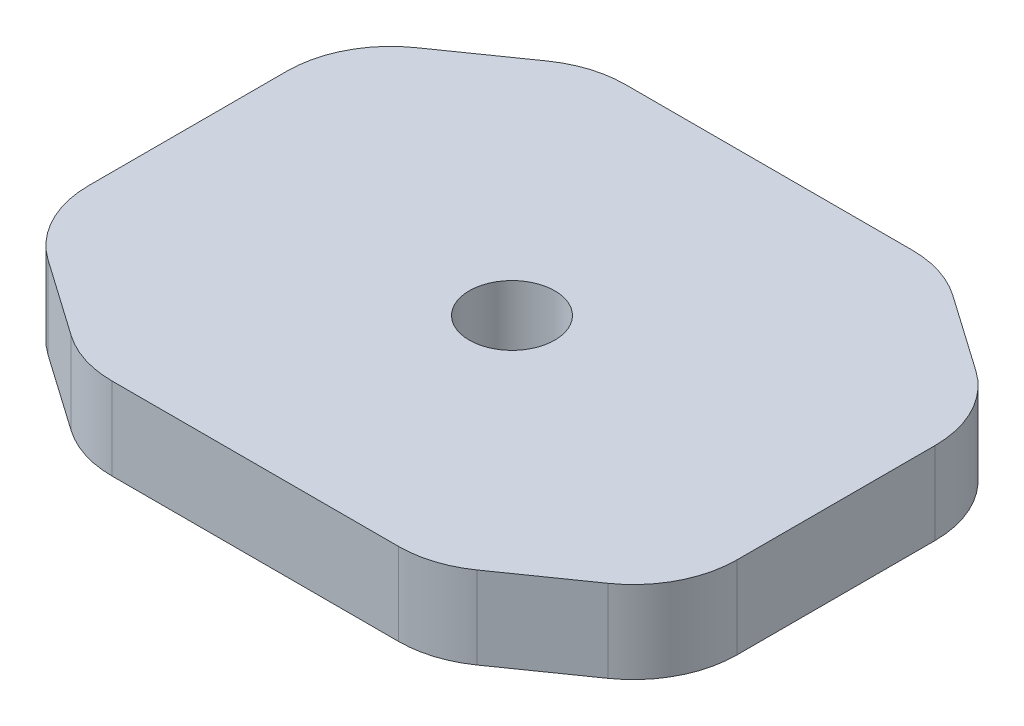
ISO-10303-21;
HEADER;
FILE_DESCRIPTION(('STEP AP214'),'2;1');
FILE_NAME('part.step','',(''),(''),'','','');
FILE_SCHEMA(('AUTOMOTIVE_DESIGN { 1 0 10303 214 1 1 1 1 }'));
ENDSEC;
DATA;
#1=APPLICATION_CONTEXT('core data for automotive mechanical design processes');
#2=APPLICATION_PROTOCOL_DEFINITION('international standard','automotive_design',2000,#1);
#3=PRODUCT_CONTEXT('',#1,'mechanical');
#4=PRODUCT('Part','Part','',(#3));
#5=PRODUCT_RELATED_PRODUCT_CATEGORY('part','',(#4));
#6=PRODUCT_DEFINITION_FORMATION('','',#4);
#7=PRODUCT_DEFINITION_CONTEXT('part definition',#1,'design');
#8=PRODUCT_DEFINITION('design','',#6,#7);
#9=PRODUCT_DEFINITION_SHAPE('','',#8);
#10=(LENGTH_UNIT() NAMED_UNIT(*) SI_UNIT(.MILLI.,.METRE.));
#11=(NAMED_UNIT(*) PLANE_ANGLE_UNIT() SI_UNIT($,.RADIAN.));
#12=(NAMED_UNIT(*) SI_UNIT($,.STERADIAN.) SOLID_ANGLE_UNIT());
#13=UNCERTAINTY_MEASURE_WITH_UNIT(LENGTH_MEASURE(1.E-05),#10,'distance_accuracy_value','');
#14=(GEOMETRIC_REPRESENTATION_CONTEXT(3) GLOBAL_UNCERTAINTY_ASSIGNED_CONTEXT((#13)) GLOBAL_UNIT_ASSIGNED_CONTEXT((#10,
#11,#12)) REPRESENTATION_CONTEXT('',''));
#15=CARTESIAN_POINT('',(0.,0.,0.));
#16=DIRECTION('',(0.,0.,1.));
#17=DIRECTION('',(1.,0.,0.));
#18=AXIS2_PLACEMENT_3D('',#15,#16,#17);
#19=CARTESIAN_POINT('',(12.5,3.175,-9.9));
#20=DIRECTION('',(-1.,0.,0.));
#21=DIRECTION('',(0.,0.,1.));
#22=AXIS2_PLACEMENT_3D('',#19,#20,#21);
#23=PLANE('',#22);
#24=DIRECTION('',(0.,0.,-1.));
#25=VECTOR('',#24,1.);
#26=CARTESIAN_POINT('',(12.5,3.175,-9.9));
#27=LINE('',#26,#25);
#28=CARTESIAN_POINT('',(12.5,3.175,3.817731797793));
#29=VERTEX_POINT('',#28);
#30=CARTESIAN_POINT('',(12.5,3.175,-3.81773179779301));
#31=VERTEX_POINT('',#30);
#32=EDGE_CURVE('E195',#29,#31,#27,.T.);
#33=ORIENTED_EDGE('',*,*,#32,.F.);
#34=DIRECTION('',(0.,1.,0.));
#35=VECTOR('',#34,1.);
#36=CARTESIAN_POINT('',(12.5,0.,3.81773179779301));
#37=LINE('',#36,#35);
#38=CARTESIAN_POINT('',(12.5,0.,3.817731797793));
#39=VERTEX_POINT('',#38);
#40=EDGE_CURVE('E12',#29,#39,#37,.F.);
#41=ORIENTED_EDGE('',*,*,#40,.T.);
#42=DIRECTION('',(0.,0.,-1.));
#43=VECTOR('',#42,1.);
#44=CARTESIAN_POINT('',(12.5,0.,-9.9));
#45=LINE('',#44,#43);
#46=CARTESIAN_POINT('',(12.5,0.,-3.81773179779301));
#47=VERTEX_POINT('',#46);
#48=EDGE_CURVE('E183',#39,#47,#45,.T.);
#49=ORIENTED_EDGE('',*,*,#48,.T.);
#50=DIRECTION('',(0.,-1.,0.));
#51=VECTOR('',#50,1.);
#52=CARTESIAN_POINT('',(12.5,3.175,-3.81773179779301));
#53=LINE('',#52,#51);
#54=EDGE_CURVE('E48',#47,#31,#53,.F.);
#55=ORIENTED_EDGE('',*,*,#54,.T.);
#56=EDGE_LOOP('',(#33,#41,#49,#55));
#57=FACE_BOUND('',#56,.T.);
#58=ADVANCED_FACE('F40',(#57),#23,.F.);
#59=CARTESIAN_POINT('',(-12.5,3.175,-9.9));
#60=DIRECTION('',(0.,0.,1.));
#61=DIRECTION('',(1.,0.,0.));
#62=AXIS2_PLACEMENT_3D('',#59,#60,#61);
#63=PLANE('',#62);
#64=DIRECTION('',(-1.,0.,0.));
#65=VECTOR('',#64,1.);
#66=CARTESIAN_POINT('',(-12.5,3.175,-9.9));
#67=LINE('',#66,#65);
#68=CARTESIAN_POINT('',(5.52621281751561,3.175,-9.9));
#69=VERTEX_POINT('',#68);
#70=CARTESIAN_POINT('',(-5.52621281751561,3.175,-9.9));
#71=VERTEX_POINT('',#70);
#72=EDGE_CURVE('E175',#69,#71,#67,.T.);
#73=ORIENTED_EDGE('',*,*,#72,.F.);
#74=DIRECTION('',(0.,1.,0.));
#75=VECTOR('',#74,1.);
#76=CARTESIAN_POINT('',(5.52621281751561,0.,-9.9));
#77=LINE('',#76,#75);
#78=CARTESIAN_POINT('',(5.52621281751561,0.,-9.9));
#79=VERTEX_POINT('',#78);
#80=EDGE_CURVE('E158',#69,#79,#77,.F.);
#81=ORIENTED_EDGE('',*,*,#80,.T.);
#82=DIRECTION('',(-1.,0.,0.));
#83=VECTOR('',#82,1.);
#84=CARTESIAN_POINT('',(-12.5,0.,-9.9));
#85=LINE('',#84,#83);
#86=CARTESIAN_POINT('',(-5.52621281751561,0.,-9.9));
#87=VERTEX_POINT('',#86);
#88=EDGE_CURVE('E172',#79,#87,#85,.T.);
#89=ORIENTED_EDGE('',*,*,#88,.T.);
#90=DIRECTION('',(0.,-1.,0.));
#91=VECTOR('',#90,1.);
#92=CARTESIAN_POINT('',(-5.52621281751561,3.175,-9.9));
#93=LINE('',#92,#91);
#94=EDGE_CURVE('E177',#87,#71,#93,.F.);
#95=ORIENTED_EDGE('',*,*,#94,.T.);
#96=EDGE_LOOP('',(#73,#81,#89,#95));
#97=FACE_BOUND('',#96,.T.);
#98=ADVANCED_FACE('F170',(#97),#63,.F.);
#99=CARTESIAN_POINT('',(-12.5,3.175,-9.9));
#100=DIRECTION('',(1.,0.,0.));
#101=DIRECTION('',(0.,0.,-1.));
#102=AXIS2_PLACEMENT_3D('',#99,#100,#101);
#103=PLANE('',#102);
#104=DIRECTION('',(0.,0.,1.));
#105=VECTOR('',#104,1.);
#106=CARTESIAN_POINT('',(-12.5,3.175,-9.9));
#107=LINE('',#106,#105);
#108=CARTESIAN_POINT('',(-12.5,3.175,-3.81773179779301));
#109=VERTEX_POINT('',#108);
#110=CARTESIAN_POINT('',(-12.5,3.175,3.817731797793));
#111=VERTEX_POINT('',#110);
#112=EDGE_CURVE('E260',#109,#111,#107,.T.);
#113=ORIENTED_EDGE('',*,*,#112,.F.);
#114=DIRECTION('',(0.,1.,0.));
#115=VECTOR('',#114,1.);
#116=CARTESIAN_POINT('',(-12.5,0.,-3.81773179779301));
#117=LINE('',#116,#115);
#118=CARTESIAN_POINT('',(-12.5,0.,-3.81773179779301));
#119=VERTEX_POINT('',#118);
#120=EDGE_CURVE('E288',#109,#119,#117,.F.);
#121=ORIENTED_EDGE('',*,*,#120,.T.);
#122=DIRECTION('',(0.,0.,1.));
#123=VECTOR('',#122,1.);
#124=CARTESIAN_POINT('',(-12.5,0.,-9.9));
#125=LINE('',#124,#123);
#126=CARTESIAN_POINT('',(-12.5,0.,3.817731797793));
#127=VERTEX_POINT('',#126);
#128=EDGE_CURVE('E182',#119,#127,#125,.T.);
#129=ORIENTED_EDGE('',*,*,#128,.T.);
#130=DIRECTION('',(0.,-1.,0.));
#131=VECTOR('',#130,1.);
#132=CARTESIAN_POINT('',(-12.5,3.175,3.81773179779301));
#133=LINE('',#132,#131);
#134=EDGE_CURVE('E285',#127,#111,#133,.F.);
#135=ORIENTED_EDGE('',*,*,#134,.T.);
#136=EDGE_LOOP('',(#113,#121,#129,#135));
#137=FACE_BOUND('',#136,.T.);
#138=ADVANCED_FACE('F347',(#137),#103,.F.);
#139=CARTESIAN_POINT('',(-12.5,3.175,9.9));
#140=DIRECTION('',(0.,0.,-1.));
#141=DIRECTION('',(-1.,0.,0.));
#142=AXIS2_PLACEMENT_3D('',#139,#140,#141);
#143=PLANE('',#142);
#144=DIRECTION('',(1.,0.,0.));
#145=VECTOR('',#144,1.);
#146=CARTESIAN_POINT('',(-12.5,3.175,9.9));
#147=LINE('',#146,#145);
#148=CARTESIAN_POINT('',(-5.52621281751561,3.175,9.9));
#149=VERTEX_POINT('',#148);
#150=CARTESIAN_POINT('',(5.52621281751561,3.175,9.9));
#151=VERTEX_POINT('',#150);
#152=EDGE_CURVE('E199',#149,#151,#147,.T.);
#153=ORIENTED_EDGE('',*,*,#152,.F.);
#154=DIRECTION('',(0.,1.,0.));
#155=VECTOR('',#154,1.);
#156=CARTESIAN_POINT('',(-5.52621281751561,0.,9.9));
#157=LINE('',#156,#155);
#158=CARTESIAN_POINT('',(-5.52621281751561,0.,9.9));
#159=VERTEX_POINT('',#158);
#160=EDGE_CURVE('E297',#149,#159,#157,.F.);
#161=ORIENTED_EDGE('',*,*,#160,.T.);
#162=DIRECTION('',(1.,0.,0.));
#163=VECTOR('',#162,1.);
#164=CARTESIAN_POINT('',(-12.5,0.,9.9));
#165=LINE('',#164,#163);
#166=CARTESIAN_POINT('',(5.52621281751561,0.,9.9));
#167=VERTEX_POINT('',#166);
#168=EDGE_CURVE('E186',#159,#167,#165,.T.);
#169=ORIENTED_EDGE('',*,*,#168,.T.);
#170=DIRECTION('',(0.,-1.,0.));
#171=VECTOR('',#170,1.);
#172=CARTESIAN_POINT('',(5.52621281751561,3.175,9.9));
#173=LINE('',#172,#171);
#174=EDGE_CURVE('E294',#167,#151,#173,.F.);
#175=ORIENTED_EDGE('',*,*,#174,.T.);
#176=EDGE_LOOP('',(#153,#161,#169,#175));
#177=FACE_BOUND('',#176,.T.);
#178=ADVANCED_FACE('F445',(#177),#143,.F.);
#179=CARTESIAN_POINT('',(0.,3.175,0.));
#180=DIRECTION('',(0.,1.,0.));
#181=DIRECTION('',(0.,0.,1.));
#182=AXIS2_PLACEMENT_3D('',#179,#180,#181);
#183=PLANE('',#182);
#184=CARTESIAN_POINT('',(0.,3.175,0.));
#185=DIRECTION('',(0.,1.,0.));
#186=DIRECTION('',(0.,0.,1.));
#187=AXIS2_PLACEMENT_3D('',#184,#185,#186);
#188=CIRCLE('',#187,1.65);
#189=CARTESIAN_POINT('',(0.,3.175,1.65));
#190=VERTEX_POINT('',#189);
#191=EDGE_CURVE('E469',#190,#190,#188,.T.);
#192=ORIENTED_EDGE('',*,*,#191,.F.);
#193=EDGE_LOOP('',(#192));
#194=FACE_BOUND('',#193,.T.);
#195=DIRECTION('',(0.819152044288991,0.,0.573576436351048));
#196=VECTOR('',#195,1.);
#197=CARTESIAN_POINT('',(6.88446733553302,3.175,-9.83203830272264));
#198=LINE('',#197,#196);
#199=CARTESIAN_POINT('',(10.7943057454042,3.175,-7.09433997494897));
#200=VERTEX_POINT('',#199);
#201=CARTESIAN_POINT('',(7.8205185629198,3.175,-9.17660817715596));
#202=VERTEX_POINT('',#201);
#203=EDGE_CURVE('E207',#200,#202,#198,.F.);
#204=ORIENTED_EDGE('',*,*,#203,.T.);
#205=CARTESIAN_POINT('',(5.52621281751561,3.175,-5.9));
#206=DIRECTION('',(0.,1.,0.));
#207=DIRECTION('',(0.,0.,1.));
#208=AXIS2_PLACEMENT_3D('',#205,#206,#207);
#209=CIRCLE('',#208,4.);
#210=EDGE_CURVE('E274',#202,#69,#209,.T.);
#211=ORIENTED_EDGE('',*,*,#210,.T.);
#212=ORIENTED_EDGE('',*,*,#72,.T.);
#213=CARTESIAN_POINT('',(-5.52621281751561,3.175,-5.9));
#214=DIRECTION('',(0.,1.,0.));
#215=DIRECTION('',(0.,0.,1.));
#216=AXIS2_PLACEMENT_3D('',#213,#214,#215);
#217=CIRCLE('',#216,4.);
#218=CARTESIAN_POINT('',(-7.8205185629198,3.175,-9.17660817715597));
#219=VERTEX_POINT('',#218);
#220=EDGE_CURVE('E271',#71,#219,#217,.T.);
#221=ORIENTED_EDGE('',*,*,#220,.T.);
#222=DIRECTION('',(0.819152044288991,0.,-0.573576436351047));
#223=VECTOR('',#222,1.);
#224=CARTESIAN_POINT('',(-6.88446733553302,3.175,-9.83203830272264));
#225=LINE('',#224,#223);
#226=CARTESIAN_POINT('',(-10.7943057454042,3.175,-7.09433997494897));
#227=VERTEX_POINT('',#226);
#228=EDGE_CURVE('E211',#219,#227,#225,.F.);
#229=ORIENTED_EDGE('',*,*,#228,.T.);
#230=CARTESIAN_POINT('',(-8.5,3.175,-3.81773179779301));
#231=DIRECTION('',(0.,1.,0.));
#232=DIRECTION('',(0.,0.,1.));
#233=AXIS2_PLACEMENT_3D('',#230,#231,#232);
#234=CIRCLE('',#233,4.);
#235=EDGE_CURVE('E275',#227,#109,#234,.T.);
#236=ORIENTED_EDGE('',*,*,#235,.T.);
#237=ORIENTED_EDGE('',*,*,#112,.T.);
#238=CARTESIAN_POINT('',(-8.5,3.175,3.81773179779301));
#239=DIRECTION('',(0.,1.,0.));
#240=DIRECTION('',(0.,0.,1.));
#241=AXIS2_PLACEMENT_3D('',#238,#239,#240);
#242=CIRCLE('',#241,4.);
#243=CARTESIAN_POINT('',(-10.7943057454042,3.175,7.09433997494897));
#244=VERTEX_POINT('',#243);
#245=EDGE_CURVE('E62',#111,#244,#242,.T.);
#246=ORIENTED_EDGE('',*,*,#245,.T.);
#247=DIRECTION('',(-0.819152044288991,0.,-0.573576436351048));
#248=VECTOR('',#247,1.);
#249=CARTESIAN_POINT('',(-6.88446733553302,3.175,9.83203830272264));
#250=LINE('',#249,#248);
#251=CARTESIAN_POINT('',(-7.8205185629198,3.175,9.17660817715596));
#252=VERTEX_POINT('',#251);
#253=EDGE_CURVE('E215',#244,#252,#250,.F.);
#254=ORIENTED_EDGE('',*,*,#253,.T.);
#255=CARTESIAN_POINT('',(-5.52621281751561,3.175,5.9));
#256=DIRECTION('',(0.,1.,0.));
#257=DIRECTION('',(0.,0.,1.));
#258=AXIS2_PLACEMENT_3D('',#255,#256,#257);
#259=CIRCLE('',#258,4.);
#260=EDGE_CURVE('E449',#252,#149,#259,.T.);
#261=ORIENTED_EDGE('',*,*,#260,.T.);
#262=ORIENTED_EDGE('',*,*,#152,.T.);
#263=CARTESIAN_POINT('',(5.52621281751561,3.175,5.9));
#264=DIRECTION('',(0.,1.,0.));
#265=DIRECTION('',(0.,0.,1.));
#266=AXIS2_PLACEMENT_3D('',#263,#264,#265);
#267=CIRCLE('',#266,4.);
#268=CARTESIAN_POINT('',(7.8205185629198,3.175,9.17660817715596));
#269=VERTEX_POINT('',#268);
#270=EDGE_CURVE('E244',#151,#269,#267,.T.);
#271=ORIENTED_EDGE('',*,*,#270,.T.);
#272=DIRECTION('',(-0.819152044288991,0.,0.573576436351047));
#273=VECTOR('',#272,1.);
#274=CARTESIAN_POINT('',(6.88446733553302,3.175,9.83203830272264));
#275=LINE('',#274,#273);
#276=CARTESIAN_POINT('',(10.7943057454042,3.175,7.09433997494897));
#277=VERTEX_POINT('',#276);
#278=EDGE_CURVE('E218',#269,#277,#275,.F.);
#279=ORIENTED_EDGE('',*,*,#278,.T.);
#280=CARTESIAN_POINT('',(8.5,3.175,3.81773179779301));
#281=DIRECTION('',(0.,1.,0.));
#282=DIRECTION('',(0.,0.,1.));
#283=AXIS2_PLACEMENT_3D('',#280,#281,#282);
#284=CIRCLE('',#283,4.);
#285=EDGE_CURVE('E240',#277,#29,#284,.T.);
#286=ORIENTED_EDGE('',*,*,#285,.T.);
#287=ORIENTED_EDGE('',*,*,#32,.T.);
#288=CARTESIAN_POINT('',(8.5,3.175,-3.81773179779301));
#289=DIRECTION('',(0.,1.,0.));
#290=DIRECTION('',(0.,0.,1.));
#291=AXIS2_PLACEMENT_3D('',#288,#289,#290);
#292=CIRCLE('',#291,4.);
#293=EDGE_CURVE('E236',#31,#200,#292,.T.);
#294=ORIENTED_EDGE('',*,*,#293,.T.);
#295=EDGE_LOOP('',(#204,#211,#212,#221,#229,#236,#237,#246,#254,#261,#262,#271,#279,#286,#287,#294));
#296=FACE_BOUND('',#295,.T.);
#297=ADVANCED_FACE('F311',(#194,#296),#183,.T.);
#298=CARTESIAN_POINT('',(0.,0.,0.));
#299=DIRECTION('',(0.,1.,0.));
#300=DIRECTION('',(0.,0.,1.));
#301=AXIS2_PLACEMENT_3D('',#298,#299,#300);
#302=PLANE('',#301);
#303=CARTESIAN_POINT('',(0.,0.,0.));
#304=DIRECTION('',(0.,1.,0.));
#305=DIRECTION('',(0.,0.,1.));
#306=AXIS2_PLACEMENT_3D('',#303,#304,#305);
#307=CIRCLE('',#306,1.65);
#308=CARTESIAN_POINT('',(0.,0.,1.65));
#309=VERTEX_POINT('',#308);
#310=EDGE_CURVE('E189',#309,#309,#307,.F.);
#311=ORIENTED_EDGE('',*,*,#310,.F.);
#312=EDGE_LOOP('',(#311));
#313=FACE_BOUND('',#312,.T.);
#314=ORIENTED_EDGE('',*,*,#88,.F.);
#315=CARTESIAN_POINT('',(5.52621281751561,0.,-5.9));
#316=DIRECTION('',(0.,1.,0.));
#317=DIRECTION('',(0.,0.,1.));
#318=AXIS2_PLACEMENT_3D('',#315,#316,#317);
#319=CIRCLE('',#318,4.);
#320=CARTESIAN_POINT('',(7.8205185629198,0.,-9.17660817715596));
#321=VERTEX_POINT('',#320);
#322=EDGE_CURVE('E154',#79,#321,#319,.F.);
#323=ORIENTED_EDGE('',*,*,#322,.T.);
#324=DIRECTION('',(-0.819152044288991,0.,-0.573576436351048));
#325=VECTOR('',#324,1.);
#326=CARTESIAN_POINT('',(6.78740797303155,0.,-9.9));
#327=LINE('',#326,#325);
#328=CARTESIAN_POINT('',(10.7943057454042,0.,-7.09433997494897));
#329=VERTEX_POINT('',#328);
#330=EDGE_CURVE('E196',#321,#329,#327,.F.);
#331=ORIENTED_EDGE('',*,*,#330,.T.);
#332=CARTESIAN_POINT('',(8.5,0.,-3.81773179779301));
#333=DIRECTION('',(0.,1.,0.));
#334=DIRECTION('',(0.,0.,1.));
#335=AXIS2_PLACEMENT_3D('',#332,#333,#334);
#336=CIRCLE('',#335,4.);
#337=EDGE_CURVE('E176',#329,#47,#336,.F.);
#338=ORIENTED_EDGE('',*,*,#337,.T.);
#339=ORIENTED_EDGE('',*,*,#48,.F.);
#340=CARTESIAN_POINT('',(8.5,0.,3.81773179779301));
#341=DIRECTION('',(0.,1.,0.));
#342=DIRECTION('',(0.,0.,1.));
#343=AXIS2_PLACEMENT_3D('',#340,#341,#342);
#344=CIRCLE('',#343,4.);
#345=CARTESIAN_POINT('',(10.7943057454042,0.,7.09433997494897));
#346=VERTEX_POINT('',#345);
#347=EDGE_CURVE('E224',#39,#346,#344,.F.);
#348=ORIENTED_EDGE('',*,*,#347,.T.);
#349=DIRECTION('',(0.819152044288991,0.,-0.573576436351047));
#350=VECTOR('',#349,1.);
#351=CARTESIAN_POINT('',(12.5,0.,5.89999999999999));
#352=LINE('',#351,#350);
#353=CARTESIAN_POINT('',(7.8205185629198,0.,9.17660817715596));
#354=VERTEX_POINT('',#353);
#355=EDGE_CURVE('E204',#346,#354,#352,.F.);
#356=ORIENTED_EDGE('',*,*,#355,.T.);
#357=CARTESIAN_POINT('',(5.52621281751561,0.,5.9));
#358=DIRECTION('',(0.,1.,0.));
#359=DIRECTION('',(0.,0.,1.));
#360=AXIS2_PLACEMENT_3D('',#357,#358,#359);
#361=CIRCLE('',#360,4.);
#362=EDGE_CURVE('E226',#354,#167,#361,.F.);
#363=ORIENTED_EDGE('',*,*,#362,.T.);
#364=ORIENTED_EDGE('',*,*,#168,.F.);
#365=CARTESIAN_POINT('',(-5.52621281751561,0.,5.9));
#366=DIRECTION('',(0.,1.,0.));
#367=DIRECTION('',(0.,0.,1.));
#368=AXIS2_PLACEMENT_3D('',#365,#366,#367);
#369=CIRCLE('',#368,4.);
#370=CARTESIAN_POINT('',(-7.8205185629198,0.,9.17660817715596));
#371=VERTEX_POINT('',#370);
#372=EDGE_CURVE('E228',#159,#371,#369,.F.);
#373=ORIENTED_EDGE('',*,*,#372,.T.);
#374=DIRECTION('',(0.819152044288991,0.,0.573576436351048));
#375=VECTOR('',#374,1.);
#376=CARTESIAN_POINT('',(-6.78740797303155,0.,9.9));
#377=LINE('',#376,#375);
#378=CARTESIAN_POINT('',(-10.7943057454042,0.,7.09433997494897));
#379=VERTEX_POINT('',#378);
#380=EDGE_CURVE('E201',#371,#379,#377,.F.);
#381=ORIENTED_EDGE('',*,*,#380,.T.);
#382=CARTESIAN_POINT('',(-8.5,0.,3.81773179779301));
#383=DIRECTION('',(0.,1.,0.));
#384=DIRECTION('',(0.,0.,1.));
#385=AXIS2_PLACEMENT_3D('',#382,#383,#384);
#386=CIRCLE('',#385,4.);
#387=EDGE_CURVE('E230',#379,#127,#386,.F.);
#388=ORIENTED_EDGE('',*,*,#387,.T.);
#389=ORIENTED_EDGE('',*,*,#128,.F.);
#390=CARTESIAN_POINT('',(-8.5,0.,-3.81773179779301));
#391=DIRECTION('',(0.,1.,0.));
#392=DIRECTION('',(0.,0.,1.));
#393=AXIS2_PLACEMENT_3D('',#390,#391,#392);
#394=CIRCLE('',#393,4.);
#395=CARTESIAN_POINT('',(-10.7943057454042,0.,-7.09433997494897));
#396=VERTEX_POINT('',#395);
#397=EDGE_CURVE('E232',#119,#396,#394,.F.);
#398=ORIENTED_EDGE('',*,*,#397,.T.);
#399=DIRECTION('',(-0.819152044288991,0.,0.573576436351047));
#400=VECTOR('',#399,1.);
#401=CARTESIAN_POINT('',(-12.5,0.,-5.89999999999999));
#402=LINE('',#401,#400);
#403=CARTESIAN_POINT('',(-7.8205185629198,0.,-9.17660817715597));
#404=VERTEX_POINT('',#403);
#405=EDGE_CURVE('E198',#396,#404,#402,.F.);
#406=ORIENTED_EDGE('',*,*,#405,.T.);
#407=CARTESIAN_POINT('',(-5.52621281751561,0.,-5.9));
#408=DIRECTION('',(0.,1.,0.));
#409=DIRECTION('',(0.,0.,1.));
#410=AXIS2_PLACEMENT_3D('',#407,#408,#409);
#411=CIRCLE('',#410,4.);
#412=EDGE_CURVE('E165',#404,#87,#411,.F.);
#413=ORIENTED_EDGE('',*,*,#412,.T.);
#414=EDGE_LOOP('',(#314,#323,#331,#338,#339,#348,#356,#363,#364,#373,#381,#388,#389,#398,#406,#413));
#415=FACE_BOUND('',#414,.T.);
#416=ADVANCED_FACE('F179',(#313,#415),#302,.F.);
#417=CARTESIAN_POINT('',(0.,-4.66690475583121,0.));
#418=DIRECTION('',(0.,1.,0.));
#419=DIRECTION('',(0.,0.,1.));
#420=AXIS2_PLACEMENT_3D('',#417,#418,#419);
#421=CYLINDRICAL_SURFACE('',#420,1.65);
#422=ORIENTED_EDGE('',*,*,#310,.T.);
#423=EDGE_LOOP('',(#422));
#424=FACE_BOUND('',#423,.T.);
#425=ORIENTED_EDGE('',*,*,#191,.T.);
#426=EDGE_LOOP('',(#425));
#427=FACE_BOUND('',#426,.T.);
#428=ADVANCED_FACE('F359',(#424,#427),#421,.F.);
#429=CARTESIAN_POINT('',(12.5,3.175,5.89999999999999));
#430=DIRECTION('',(-0.573576436351047,0.,-0.819152044288991));
#431=DIRECTION('',(0.,-1.,0.));
#432=AXIS2_PLACEMENT_3D('',#429,#430,#431);
#433=PLANE('',#432);
#434=ORIENTED_EDGE('',*,*,#278,.F.);
#435=DIRECTION('',(0.,1.,0.));
#436=VECTOR('',#435,1.);
#437=CARTESIAN_POINT('',(7.8205185629198,0.,9.17660817715596));
#438=LINE('',#437,#436);
#439=EDGE_CURVE('E302',#269,#354,#438,.F.);
#440=ORIENTED_EDGE('',*,*,#439,.T.);
#441=ORIENTED_EDGE('',*,*,#355,.F.);
#442=DIRECTION('',(0.,-1.,0.));
#443=VECTOR('',#442,1.);
#444=CARTESIAN_POINT('',(10.7943057454042,3.175,7.09433997494897));
#445=LINE('',#444,#443);
#446=EDGE_CURVE('E300',#346,#277,#445,.F.);
#447=ORIENTED_EDGE('',*,*,#446,.T.);
#448=EDGE_LOOP('',(#434,#440,#441,#447));
#449=FACE_BOUND('',#448,.T.);
#450=ADVANCED_FACE('F352',(#449),#433,.F.);
#451=CARTESIAN_POINT('',(-6.78740797303155,3.175,9.9));
#452=DIRECTION('',(0.573576436351048,0.,-0.819152044288991));
#453=DIRECTION('',(0.,-1.,0.));
#454=AXIS2_PLACEMENT_3D('',#451,#452,#453);
#455=PLANE('',#454);
#456=ORIENTED_EDGE('',*,*,#253,.F.);
#457=DIRECTION('',(0.,1.,0.));
#458=VECTOR('',#457,1.);
#459=CARTESIAN_POINT('',(-10.7943057454042,0.,7.09433997494897));
#460=LINE('',#459,#458);
#461=EDGE_CURVE('E292',#244,#379,#460,.F.);
#462=ORIENTED_EDGE('',*,*,#461,.T.);
#463=ORIENTED_EDGE('',*,*,#380,.F.);
#464=DIRECTION('',(0.,-1.,0.));
#465=VECTOR('',#464,1.);
#466=CARTESIAN_POINT('',(-7.8205185629198,3.175,9.17660817715596));
#467=LINE('',#466,#465);
#468=EDGE_CURVE('E55',#371,#252,#467,.F.);
#469=ORIENTED_EDGE('',*,*,#468,.T.);
#470=EDGE_LOOP('',(#456,#462,#463,#469));
#471=FACE_BOUND('',#470,.T.);
#472=ADVANCED_FACE('F358',(#471),#455,.F.);
#473=CARTESIAN_POINT('',(-12.5,3.175,-5.89999999999999));
#474=DIRECTION('',(0.573576436351047,0.,0.819152044288991));
#475=DIRECTION('',(0.,-1.,0.));
#476=AXIS2_PLACEMENT_3D('',#473,#474,#475);
#477=PLANE('',#476);
#478=ORIENTED_EDGE('',*,*,#228,.F.);
#479=DIRECTION('',(0.,1.,0.));
#480=VECTOR('',#479,1.);
#481=CARTESIAN_POINT('',(-7.8205185629198,0.,-9.17660817715596));
#482=LINE('',#481,#480);
#483=EDGE_CURVE('E283',#219,#404,#482,.F.);
#484=ORIENTED_EDGE('',*,*,#483,.T.);
#485=ORIENTED_EDGE('',*,*,#405,.F.);
#486=DIRECTION('',(0.,-1.,0.));
#487=VECTOR('',#486,1.);
#488=CARTESIAN_POINT('',(-10.7943057454042,3.175,-7.09433997494897));
#489=LINE('',#488,#487);
#490=EDGE_CURVE('E281',#396,#227,#489,.F.);
#491=ORIENTED_EDGE('',*,*,#490,.T.);
#492=EDGE_LOOP('',(#478,#484,#485,#491));
#493=FACE_BOUND('',#492,.T.);
#494=ADVANCED_FACE('F327',(#493),#477,.F.);
#495=CARTESIAN_POINT('',(6.78740797303155,3.175,-9.9));
#496=DIRECTION('',(-0.573576436351047,0.,0.819152044288991));
#497=DIRECTION('',(0.,-1.,0.));
#498=AXIS2_PLACEMENT_3D('',#495,#496,#497);
#499=PLANE('',#498);
#500=ORIENTED_EDGE('',*,*,#330,.F.);
#501=DIRECTION('',(0.,-1.,0.));
#502=VECTOR('',#501,1.);
#503=CARTESIAN_POINT('',(7.8205185629198,3.175,-9.17660817715596));
#504=LINE('',#503,#502);
#505=EDGE_CURVE('E159',#321,#202,#504,.F.);
#506=ORIENTED_EDGE('',*,*,#505,.T.);
#507=ORIENTED_EDGE('',*,*,#203,.F.);
#508=DIRECTION('',(0.,1.,0.));
#509=VECTOR('',#508,1.);
#510=CARTESIAN_POINT('',(10.7943057454042,0.,-7.09433997494897));
#511=LINE('',#510,#509);
#512=EDGE_CURVE('E164',#200,#329,#511,.F.);
#513=ORIENTED_EDGE('',*,*,#512,.T.);
#514=EDGE_LOOP('',(#500,#506,#507,#513));
#515=FACE_BOUND('',#514,.T.);
#516=ADVANCED_FACE('F321',(#515),#499,.F.);
#517=CARTESIAN_POINT('',(5.52621281751561,3.175,-5.9));
#518=DIRECTION('',(0.,-1.,0.));
#519=DIRECTION('',(0.,0.,-1.));
#520=AXIS2_PLACEMENT_3D('',#517,#518,#519);
#521=CYLINDRICAL_SURFACE('',#520,4.);
#522=ORIENTED_EDGE('',*,*,#210,.F.);
#523=ORIENTED_EDGE('',*,*,#505,.F.);
#524=ORIENTED_EDGE('',*,*,#322,.F.);
#525=ORIENTED_EDGE('',*,*,#80,.F.);
#526=EDGE_LOOP('',(#522,#523,#524,#525));
#527=FACE_BOUND('',#526,.T.);
#528=ADVANCED_FACE('F157',(#527),#521,.T.);
#529=CARTESIAN_POINT('',(-5.52621281751561,3.175,-5.9));
#530=DIRECTION('',(0.,1.,0.));
#531=DIRECTION('',(0.,0.,1.));
#532=AXIS2_PLACEMENT_3D('',#529,#530,#531);
#533=CYLINDRICAL_SURFACE('',#532,4.);
#534=ORIENTED_EDGE('',*,*,#412,.F.);
#535=ORIENTED_EDGE('',*,*,#483,.F.);
#536=ORIENTED_EDGE('',*,*,#220,.F.);
#537=ORIENTED_EDGE('',*,*,#94,.F.);
#538=EDGE_LOOP('',(#534,#535,#536,#537));
#539=FACE_BOUND('',#538,.T.);
#540=ADVANCED_FACE('F330',(#539),#533,.T.);
#541=CARTESIAN_POINT('',(-8.5,3.175,-3.81773179779301));
#542=DIRECTION('',(0.,-1.,0.));
#543=DIRECTION('',(0.,0.,-1.));
#544=AXIS2_PLACEMENT_3D('',#541,#542,#543);
#545=CYLINDRICAL_SURFACE('',#544,4.);
#546=ORIENTED_EDGE('',*,*,#235,.F.);
#547=ORIENTED_EDGE('',*,*,#490,.F.);
#548=ORIENTED_EDGE('',*,*,#397,.F.);
#549=ORIENTED_EDGE('',*,*,#120,.F.);
#550=EDGE_LOOP('',(#546,#547,#548,#549));
#551=FACE_BOUND('',#550,.T.);
#552=ADVANCED_FACE('F332',(#551),#545,.T.);
#553=CARTESIAN_POINT('',(-8.5,3.175,3.81773179779301));
#554=DIRECTION('',(0.,1.,0.));
#555=DIRECTION('',(0.,0.,1.));
#556=AXIS2_PLACEMENT_3D('',#553,#554,#555);
#557=CYLINDRICAL_SURFACE('',#556,4.);
#558=ORIENTED_EDGE('',*,*,#387,.F.);
#559=ORIENTED_EDGE('',*,*,#461,.F.);
#560=ORIENTED_EDGE('',*,*,#245,.F.);
#561=ORIENTED_EDGE('',*,*,#134,.F.);
#562=EDGE_LOOP('',(#558,#559,#560,#561));
#563=FACE_BOUND('',#562,.T.);
#564=ADVANCED_FACE('F338',(#563),#557,.T.);
#565=CARTESIAN_POINT('',(-5.52621281751561,3.175,5.9));
#566=DIRECTION('',(0.,-1.,0.));
#567=DIRECTION('',(0.,0.,-1.));
#568=AXIS2_PLACEMENT_3D('',#565,#566,#567);
#569=CYLINDRICAL_SURFACE('',#568,4.);
#570=ORIENTED_EDGE('',*,*,#260,.F.);
#571=ORIENTED_EDGE('',*,*,#468,.F.);
#572=ORIENTED_EDGE('',*,*,#372,.F.);
#573=ORIENTED_EDGE('',*,*,#160,.F.);
#574=EDGE_LOOP('',(#570,#571,#572,#573));
#575=FACE_BOUND('',#574,.T.);
#576=ADVANCED_FACE('F401',(#575),#569,.T.);
#577=CARTESIAN_POINT('',(5.52621281751561,3.175,5.9));
#578=DIRECTION('',(0.,1.,0.));
#579=DIRECTION('',(0.,0.,1.));
#580=AXIS2_PLACEMENT_3D('',#577,#578,#579);
#581=CYLINDRICAL_SURFACE('',#580,4.);
#582=ORIENTED_EDGE('',*,*,#362,.F.);
#583=ORIENTED_EDGE('',*,*,#439,.F.);
#584=ORIENTED_EDGE('',*,*,#270,.F.);
#585=ORIENTED_EDGE('',*,*,#174,.F.);
#586=EDGE_LOOP('',(#582,#583,#584,#585));
#587=FACE_BOUND('',#586,.T.);
#588=ADVANCED_FACE('F411',(#587),#581,.T.);
#589=CARTESIAN_POINT('',(8.5,3.175,3.81773179779301));
#590=DIRECTION('',(0.,-1.,0.));
#591=DIRECTION('',(0.,0.,-1.));
#592=AXIS2_PLACEMENT_3D('',#589,#590,#591);
#593=CYLINDRICAL_SURFACE('',#592,4.);
#594=ORIENTED_EDGE('',*,*,#285,.F.);
#595=ORIENTED_EDGE('',*,*,#446,.F.);
#596=ORIENTED_EDGE('',*,*,#347,.F.);
#597=ORIENTED_EDGE('',*,*,#40,.F.);
#598=EDGE_LOOP('',(#594,#595,#596,#597));
#599=FACE_BOUND('',#598,.T.);
#600=ADVANCED_FACE('F317',(#599),#593,.T.);
#601=CARTESIAN_POINT('',(8.5,3.175,-3.81773179779301));
#602=DIRECTION('',(0.,1.,0.));
#603=DIRECTION('',(0.,0.,1.));
#604=AXIS2_PLACEMENT_3D('',#601,#602,#603);
#605=CYLINDRICAL_SURFACE('',#604,4.);
#606=ORIENTED_EDGE('',*,*,#337,.F.);
#607=ORIENTED_EDGE('',*,*,#512,.F.);
#608=ORIENTED_EDGE('',*,*,#293,.F.);
#609=ORIENTED_EDGE('',*,*,#54,.F.);
#610=EDGE_LOOP('',(#606,#607,#608,#609));
#611=FACE_BOUND('',#610,.T.);
#612=ADVANCED_FACE('F42',(#611),#605,.T.);
#613=CLOSED_SHELL('',(#58,#98,#138,#178,#297,#416,#428,#450,#472,#494,#516,#528,#540,#552,#564,
#576,#588,#600,#612));
#614=MANIFOLD_SOLID_BREP('B2',#613);
#615=ADVANCED_BREP_SHAPE_REPRESENTATION('',(#18,#614),#14);
#616=SHAPE_DEFINITION_REPRESENTATION(#9,#615);
ENDSEC;
END-ISO-10303-21;
